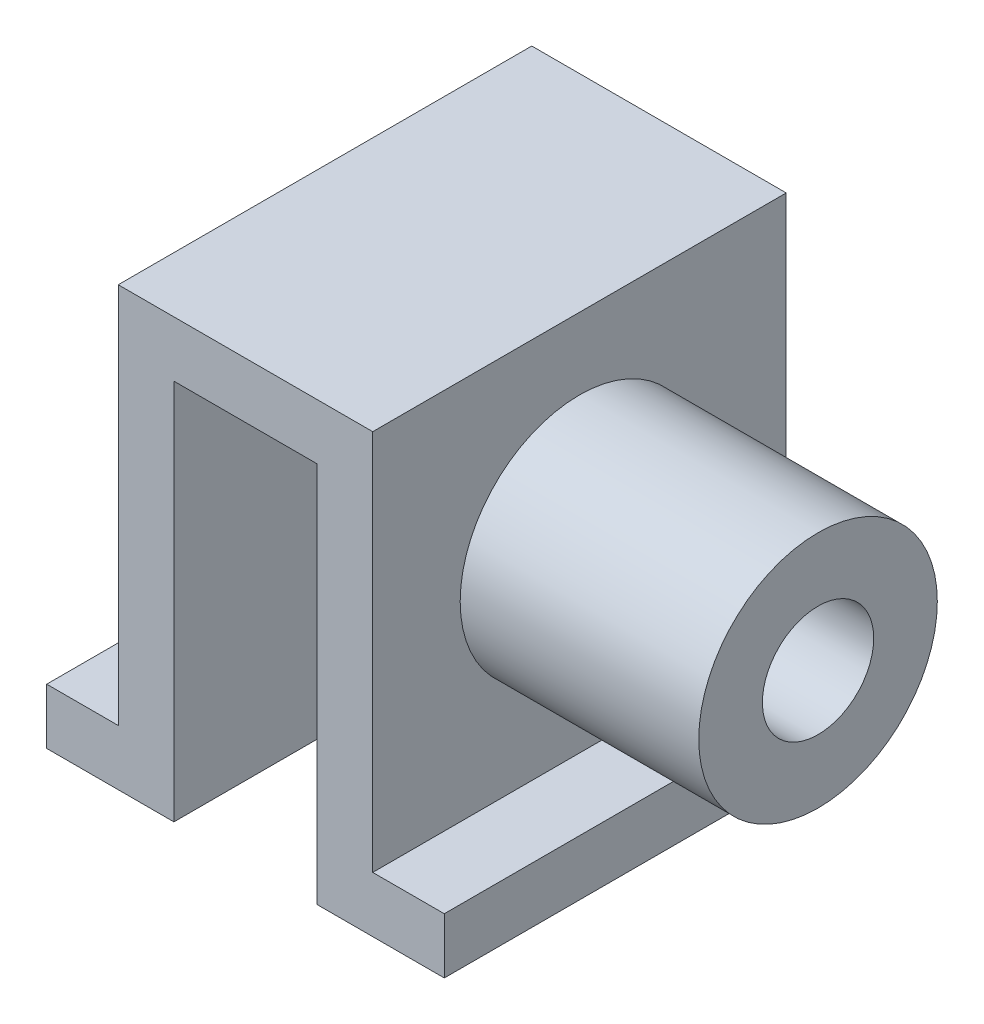
ISO-10303-21;
HEADER;
FILE_DESCRIPTION(('STEP AP214'),'2;1');
FILE_NAME('part.step','',(''),(''),'','','');
FILE_SCHEMA(('AUTOMOTIVE_DESIGN { 1 0 10303 214 1 1 1 1 }'));
ENDSEC;
DATA;
#1=APPLICATION_CONTEXT('core data for automotive mechanical design processes');
#2=APPLICATION_PROTOCOL_DEFINITION('international standard','automotive_design',2000,#1);
#3=PRODUCT_CONTEXT('',#1,'mechanical');
#4=PRODUCT('Part','Part','',(#3));
#5=PRODUCT_RELATED_PRODUCT_CATEGORY('part','',(#4));
#6=PRODUCT_DEFINITION_FORMATION('','',#4);
#7=PRODUCT_DEFINITION_CONTEXT('part definition',#1,'design');
#8=PRODUCT_DEFINITION('design','',#6,#7);
#9=PRODUCT_DEFINITION_SHAPE('','',#8);
#10=(LENGTH_UNIT() NAMED_UNIT(*) SI_UNIT(.MILLI.,.METRE.));
#11=(NAMED_UNIT(*) PLANE_ANGLE_UNIT() SI_UNIT($,.RADIAN.));
#12=(NAMED_UNIT(*) SI_UNIT($,.STERADIAN.) SOLID_ANGLE_UNIT());
#13=UNCERTAINTY_MEASURE_WITH_UNIT(LENGTH_MEASURE(1.E-05),#10,'distance_accuracy_value','');
#14=(GEOMETRIC_REPRESENTATION_CONTEXT(3) GLOBAL_UNCERTAINTY_ASSIGNED_CONTEXT((#13)) GLOBAL_UNIT_ASSIGNED_CONTEXT((#10,
#11,#12)) REPRESENTATION_CONTEXT('',''));
#15=CARTESIAN_POINT('',(0.,0.,0.));
#16=DIRECTION('',(0.,0.,1.));
#17=DIRECTION('',(1.,0.,0.));
#18=AXIS2_PLACEMENT_3D('',#15,#16,#17);
#19=CARTESIAN_POINT('',(16.,7.,26.));
#20=DIRECTION('',(0.,-1.,0.));
#21=DIRECTION('',(0.,0.,-1.));
#22=AXIS2_PLACEMENT_3D('',#19,#20,#21);
#23=PLANE('',#22);
#24=DIRECTION('',(-1.,0.,0.));
#25=VECTOR('',#24,1.);
#26=CARTESIAN_POINT('',(16.,7.,-26.));
#27=LINE('',#26,#25);
#28=CARTESIAN_POINT('',(25.,7.,-26.));
#29=VERTEX_POINT('',#28);
#30=CARTESIAN_POINT('',(16.,7.,-26.));
#31=VERTEX_POINT('',#30);
#32=EDGE_CURVE('E164',#29,#31,#27,.T.);
#33=ORIENTED_EDGE('',*,*,#32,.T.);
#34=DIRECTION('',(0.,0.,-1.));
#35=VECTOR('',#34,1.);
#36=CARTESIAN_POINT('',(16.,7.,26.));
#37=LINE('',#36,#35);
#38=CARTESIAN_POINT('',(16.,7.,26.));
#39=VERTEX_POINT('',#38);
#40=EDGE_CURVE('E48',#39,#31,#37,.T.);
#41=ORIENTED_EDGE('',*,*,#40,.F.);
#42=DIRECTION('',(-1.,0.,0.));
#43=VECTOR('',#42,1.);
#44=CARTESIAN_POINT('',(16.,7.,26.));
#45=LINE('',#44,#43);
#46=CARTESIAN_POINT('',(25.,7.,26.));
#47=VERTEX_POINT('',#46);
#48=EDGE_CURVE('E202',#47,#39,#45,.T.);
#49=ORIENTED_EDGE('',*,*,#48,.F.);
#50=DIRECTION('',(0.,0.,-1.));
#51=VECTOR('',#50,1.);
#52=CARTESIAN_POINT('',(25.,7.,26.));
#53=LINE('',#52,#51);
#54=EDGE_CURVE('E160',#47,#29,#53,.T.);
#55=ORIENTED_EDGE('',*,*,#54,.T.);
#56=EDGE_LOOP('',(#33,#41,#49,#55));
#57=FACE_BOUND('',#56,.T.);
#58=ADVANCED_FACE('F39',(#57),#23,.F.);
#59=CARTESIAN_POINT('',(16.,55.,26.));
#60=DIRECTION('',(-1.,0.,0.));
#61=DIRECTION('',(0.,-1.,0.));
#62=AXIS2_PLACEMENT_3D('',#59,#60,#61);
#63=PLANE('',#62);
#64=CARTESIAN_POINT('',(16.,31.,0.));
#65=DIRECTION('',(-1.,0.,0.));
#66=DIRECTION('',(0.,-1.,0.));
#67=AXIS2_PLACEMENT_3D('',#64,#65,#66);
#68=CIRCLE('',#67,15.);
#69=CARTESIAN_POINT('',(16.,16.,0.));
#70=VERTEX_POINT('',#69);
#71=EDGE_CURVE('E11',#70,#70,#68,.F.);
#72=ORIENTED_EDGE('',*,*,#71,.F.);
#73=EDGE_LOOP('',(#72));
#74=FACE_BOUND('',#73,.T.);
#75=DIRECTION('',(0.,1.,0.));
#76=VECTOR('',#75,1.);
#77=CARTESIAN_POINT('',(16.,55.,-26.));
#78=LINE('',#77,#76);
#79=CARTESIAN_POINT('',(16.,55.,-26.));
#80=VERTEX_POINT('',#79);
#81=EDGE_CURVE('E168',#31,#80,#78,.T.);
#82=ORIENTED_EDGE('',*,*,#81,.T.);
#83=DIRECTION('',(0.,0.,-1.));
#84=VECTOR('',#83,1.);
#85=CARTESIAN_POINT('',(16.,55.,26.));
#86=LINE('',#85,#84);
#87=CARTESIAN_POINT('',(16.,55.,26.));
#88=VERTEX_POINT('',#87);
#89=EDGE_CURVE('E233',#88,#80,#86,.T.);
#90=ORIENTED_EDGE('',*,*,#89,.F.);
#91=DIRECTION('',(0.,1.,0.));
#92=VECTOR('',#91,1.);
#93=CARTESIAN_POINT('',(16.,7.,26.));
#94=LINE('',#93,#92);
#95=EDGE_CURVE('E112',#39,#88,#94,.T.);
#96=ORIENTED_EDGE('',*,*,#95,.F.);
#97=ORIENTED_EDGE('',*,*,#40,.T.);
#98=EDGE_LOOP('',(#82,#90,#96,#97));
#99=FACE_BOUND('',#98,.T.);
#100=ADVANCED_FACE('F238',(#74,#99),#63,.F.);
#101=CARTESIAN_POINT('',(-16.,55.,26.));
#102=DIRECTION('',(0.,-1.,0.));
#103=DIRECTION('',(0.,0.,-1.));
#104=AXIS2_PLACEMENT_3D('',#101,#102,#103);
#105=PLANE('',#104);
#106=DIRECTION('',(-1.,0.,0.));
#107=VECTOR('',#106,1.);
#108=CARTESIAN_POINT('',(-16.,55.,-26.));
#109=LINE('',#108,#107);
#110=CARTESIAN_POINT('',(-16.,55.,-26.));
#111=VERTEX_POINT('',#110);
#112=EDGE_CURVE('E172',#80,#111,#109,.T.);
#113=ORIENTED_EDGE('',*,*,#112,.T.);
#114=DIRECTION('',(0.,0.,-1.));
#115=VECTOR('',#114,1.);
#116=CARTESIAN_POINT('',(-16.,55.,26.));
#117=LINE('',#116,#115);
#118=CARTESIAN_POINT('',(-16.,55.,26.));
#119=VERTEX_POINT('',#118);
#120=EDGE_CURVE('E229',#119,#111,#117,.T.);
#121=ORIENTED_EDGE('',*,*,#120,.F.);
#122=DIRECTION('',(-1.,0.,0.));
#123=VECTOR('',#122,1.);
#124=CARTESIAN_POINT('',(-16.,55.,26.));
#125=LINE('',#124,#123);
#126=EDGE_CURVE('E258',#88,#119,#125,.T.);
#127=ORIENTED_EDGE('',*,*,#126,.F.);
#128=ORIENTED_EDGE('',*,*,#89,.T.);
#129=EDGE_LOOP('',(#113,#121,#127,#128));
#130=FACE_BOUND('',#129,.T.);
#131=ADVANCED_FACE('F248',(#130),#105,.F.);
#132=CARTESIAN_POINT('',(-16.,7.,26.));
#133=DIRECTION('',(1.,0.,0.));
#134=DIRECTION('',(0.,0.,-1.));
#135=AXIS2_PLACEMENT_3D('',#132,#133,#134);
#136=PLANE('',#135);
#137=DIRECTION('',(0.,-1.,0.));
#138=VECTOR('',#137,1.);
#139=CARTESIAN_POINT('',(-16.,7.,-26.));
#140=LINE('',#139,#138);
#141=CARTESIAN_POINT('',(-16.,7.,-26.));
#142=VERTEX_POINT('',#141);
#143=EDGE_CURVE('E176',#111,#142,#140,.T.);
#144=ORIENTED_EDGE('',*,*,#143,.T.);
#145=DIRECTION('',(0.,0.,-1.));
#146=VECTOR('',#145,1.);
#147=CARTESIAN_POINT('',(-16.,7.,26.));
#148=LINE('',#147,#146);
#149=CARTESIAN_POINT('',(-16.,7.,26.));
#150=VERTEX_POINT('',#149);
#151=EDGE_CURVE('E225',#150,#142,#148,.T.);
#152=ORIENTED_EDGE('',*,*,#151,.F.);
#153=DIRECTION('',(0.,-1.,0.));
#154=VECTOR('',#153,1.);
#155=CARTESIAN_POINT('',(-16.,48.,26.));
#156=LINE('',#155,#154);
#157=EDGE_CURVE('E254',#119,#150,#156,.T.);
#158=ORIENTED_EDGE('',*,*,#157,.F.);
#159=ORIENTED_EDGE('',*,*,#120,.T.);
#160=EDGE_LOOP('',(#144,#152,#158,#159));
#161=FACE_BOUND('',#160,.T.);
#162=ADVANCED_FACE('F252',(#161),#136,.F.);
#163=CARTESIAN_POINT('',(-25.,7.,26.));
#164=DIRECTION('',(0.,-1.,0.));
#165=DIRECTION('',(0.,0.,-1.));
#166=AXIS2_PLACEMENT_3D('',#163,#164,#165);
#167=PLANE('',#166);
#168=DIRECTION('',(-1.,0.,0.));
#169=VECTOR('',#168,1.);
#170=CARTESIAN_POINT('',(-25.,7.,-26.));
#171=LINE('',#170,#169);
#172=CARTESIAN_POINT('',(-25.,7.,-26.));
#173=VERTEX_POINT('',#172);
#174=EDGE_CURVE('E179',#142,#173,#171,.T.);
#175=ORIENTED_EDGE('',*,*,#174,.T.);
#176=DIRECTION('',(0.,0.,-1.));
#177=VECTOR('',#176,1.);
#178=CARTESIAN_POINT('',(-25.,7.,26.));
#179=LINE('',#178,#177);
#180=CARTESIAN_POINT('',(-25.,7.,26.));
#181=VERTEX_POINT('',#180);
#182=EDGE_CURVE('E221',#181,#173,#179,.T.);
#183=ORIENTED_EDGE('',*,*,#182,.F.);
#184=DIRECTION('',(-1.,0.,0.));
#185=VECTOR('',#184,1.);
#186=CARTESIAN_POINT('',(-25.,7.,26.));
#187=LINE('',#186,#185);
#188=EDGE_CURVE('E257',#150,#181,#187,.T.);
#189=ORIENTED_EDGE('',*,*,#188,.F.);
#190=ORIENTED_EDGE('',*,*,#151,.T.);
#191=EDGE_LOOP('',(#175,#183,#189,#190));
#192=FACE_BOUND('',#191,.T.);
#193=ADVANCED_FACE('F294',(#192),#167,.F.);
#194=CARTESIAN_POINT('',(-25.,7.,26.));
#195=DIRECTION('',(1.,0.,0.));
#196=DIRECTION('',(0.,0.,-1.));
#197=AXIS2_PLACEMENT_3D('',#194,#195,#196);
#198=PLANE('',#197);
#199=DIRECTION('',(0.,-1.,0.));
#200=VECTOR('',#199,1.);
#201=CARTESIAN_POINT('',(-25.,7.,-26.));
#202=LINE('',#201,#200);
#203=CARTESIAN_POINT('',(-25.,0.,-26.));
#204=VERTEX_POINT('',#203);
#205=EDGE_CURVE('E182',#173,#204,#202,.T.);
#206=ORIENTED_EDGE('',*,*,#205,.T.);
#207=DIRECTION('',(0.,0.,-1.));
#208=VECTOR('',#207,1.);
#209=CARTESIAN_POINT('',(-25.,0.,26.));
#210=LINE('',#209,#208);
#211=CARTESIAN_POINT('',(-25.,0.,26.));
#212=VERTEX_POINT('',#211);
#213=EDGE_CURVE('E217',#212,#204,#210,.T.);
#214=ORIENTED_EDGE('',*,*,#213,.F.);
#215=DIRECTION('',(0.,-1.,0.));
#216=VECTOR('',#215,1.);
#217=CARTESIAN_POINT('',(-25.,7.,26.));
#218=LINE('',#217,#216);
#219=EDGE_CURVE('E262',#181,#212,#218,.T.);
#220=ORIENTED_EDGE('',*,*,#219,.F.);
#221=ORIENTED_EDGE('',*,*,#182,.T.);
#222=EDGE_LOOP('',(#206,#214,#220,#221));
#223=FACE_BOUND('',#222,.T.);
#224=ADVANCED_FACE('F291',(#223),#198,.F.);
#225=CARTESIAN_POINT('',(-25.,0.,26.));
#226=DIRECTION('',(0.,1.,0.));
#227=DIRECTION('',(0.,0.,1.));
#228=AXIS2_PLACEMENT_3D('',#225,#226,#227);
#229=PLANE('',#228);
#230=DIRECTION('',(1.,0.,0.));
#231=VECTOR('',#230,1.);
#232=CARTESIAN_POINT('',(-25.,0.,-26.));
#233=LINE('',#232,#231);
#234=CARTESIAN_POINT('',(-9.,0.,-26.));
#235=VERTEX_POINT('',#234);
#236=EDGE_CURVE('E185',#204,#235,#233,.T.);
#237=ORIENTED_EDGE('',*,*,#236,.T.);
#238=DIRECTION('',(0.,0.,-1.));
#239=VECTOR('',#238,1.);
#240=CARTESIAN_POINT('',(-9.,0.,26.));
#241=LINE('',#240,#239);
#242=CARTESIAN_POINT('',(-9.,0.,26.));
#243=VERTEX_POINT('',#242);
#244=EDGE_CURVE('E213',#243,#235,#241,.T.);
#245=ORIENTED_EDGE('',*,*,#244,.F.);
#246=DIRECTION('',(1.,0.,0.));
#247=VECTOR('',#246,1.);
#248=CARTESIAN_POINT('',(-25.,0.,26.));
#249=LINE('',#248,#247);
#250=EDGE_CURVE('E269',#212,#243,#249,.T.);
#251=ORIENTED_EDGE('',*,*,#250,.F.);
#252=ORIENTED_EDGE('',*,*,#213,.T.);
#253=EDGE_LOOP('',(#237,#245,#251,#252));
#254=FACE_BOUND('',#253,.T.);
#255=ADVANCED_FACE('F287',(#254),#229,.F.);
#256=CARTESIAN_POINT('',(-9.,7.,26.));
#257=DIRECTION('',(-1.,0.,0.));
#258=DIRECTION('',(0.,-1.,0.));
#259=AXIS2_PLACEMENT_3D('',#256,#257,#258);
#260=PLANE('',#259);
#261=DIRECTION('',(0.,1.,0.));
#262=VECTOR('',#261,1.);
#263=CARTESIAN_POINT('',(-9.,7.,-26.));
#264=LINE('',#263,#262);
#265=CARTESIAN_POINT('',(-9.,48.,-26.));
#266=VERTEX_POINT('',#265);
#267=EDGE_CURVE('E189',#235,#266,#264,.T.);
#268=ORIENTED_EDGE('',*,*,#267,.T.);
#269=DIRECTION('',(0.,0.,-1.));
#270=VECTOR('',#269,1.);
#271=CARTESIAN_POINT('',(-9.,48.,26.));
#272=LINE('',#271,#270);
#273=CARTESIAN_POINT('',(-9.,48.,26.));
#274=VERTEX_POINT('',#273);
#275=EDGE_CURVE('E209',#274,#266,#272,.T.);
#276=ORIENTED_EDGE('',*,*,#275,.F.);
#277=DIRECTION('',(0.,1.,0.));
#278=VECTOR('',#277,1.);
#279=CARTESIAN_POINT('',(-9.,7.,26.));
#280=LINE('',#279,#278);
#281=EDGE_CURVE('E272',#243,#274,#280,.T.);
#282=ORIENTED_EDGE('',*,*,#281,.F.);
#283=ORIENTED_EDGE('',*,*,#244,.T.);
#284=EDGE_LOOP('',(#268,#276,#282,#283));
#285=FACE_BOUND('',#284,.T.);
#286=ADVANCED_FACE('F280',(#285),#260,.F.);
#287=CARTESIAN_POINT('',(-9.,48.,26.));
#288=DIRECTION('',(0.,1.,0.));
#289=DIRECTION('',(0.,0.,1.));
#290=AXIS2_PLACEMENT_3D('',#287,#288,#289);
#291=PLANE('',#290);
#292=DIRECTION('',(1.,0.,0.));
#293=VECTOR('',#292,1.);
#294=CARTESIAN_POINT('',(-9.,48.,-26.));
#295=LINE('',#294,#293);
#296=CARTESIAN_POINT('',(8.99999999999999,48.,-26.));
#297=VERTEX_POINT('',#296);
#298=EDGE_CURVE('E192',#266,#297,#295,.T.);
#299=ORIENTED_EDGE('',*,*,#298,.T.);
#300=DIRECTION('',(0.,0.,-1.));
#301=VECTOR('',#300,1.);
#302=CARTESIAN_POINT('',(8.99999999999999,48.,26.));
#303=LINE('',#302,#301);
#304=CARTESIAN_POINT('',(8.99999999999999,48.,26.));
#305=VERTEX_POINT('',#304);
#306=EDGE_CURVE('E153',#305,#297,#303,.T.);
#307=ORIENTED_EDGE('',*,*,#306,.F.);
#308=DIRECTION('',(1.,0.,0.));
#309=VECTOR('',#308,1.);
#310=CARTESIAN_POINT('',(-9.,48.,26.));
#311=LINE('',#310,#309);
#312=EDGE_CURVE('E143',#274,#305,#311,.T.);
#313=ORIENTED_EDGE('',*,*,#312,.F.);
#314=ORIENTED_EDGE('',*,*,#275,.T.);
#315=EDGE_LOOP('',(#299,#307,#313,#314));
#316=FACE_BOUND('',#315,.T.);
#317=ADVANCED_FACE('F283',(#316),#291,.F.);
#318=CARTESIAN_POINT('',(9.,7.,26.));
#319=DIRECTION('',(1.,0.,0.));
#320=DIRECTION('',(0.,0.,-1.));
#321=AXIS2_PLACEMENT_3D('',#318,#319,#320);
#322=PLANE('',#321);
#323=CARTESIAN_POINT('',(9.,31.,0.));
#324=DIRECTION('',(1.,0.,0.));
#325=DIRECTION('',(0.,0.,-1.));
#326=AXIS2_PLACEMENT_3D('',#323,#324,#325);
#327=CIRCLE('',#326,7.);
#328=CARTESIAN_POINT('',(9.,31.,-7.));
#329=VERTEX_POINT('',#328);
#330=EDGE_CURVE('E458',#329,#329,#327,.F.);
#331=ORIENTED_EDGE('',*,*,#330,.F.);
#332=EDGE_LOOP('',(#331));
#333=FACE_BOUND('',#332,.T.);
#334=DIRECTION('',(0.,-1.,0.));
#335=VECTOR('',#334,1.);
#336=CARTESIAN_POINT('',(9.,7.,-26.));
#337=LINE('',#336,#335);
#338=CARTESIAN_POINT('',(9.,0.,-26.));
#339=VERTEX_POINT('',#338);
#340=EDGE_CURVE('E151',#297,#339,#337,.T.);
#341=ORIENTED_EDGE('',*,*,#340,.T.);
#342=DIRECTION('',(0.,0.,-1.));
#343=VECTOR('',#342,1.);
#344=CARTESIAN_POINT('',(9.,0.,26.));
#345=LINE('',#344,#343);
#346=CARTESIAN_POINT('',(9.,0.,26.));
#347=VERTEX_POINT('',#346);
#348=EDGE_CURVE('E149',#347,#339,#345,.T.);
#349=ORIENTED_EDGE('',*,*,#348,.F.);
#350=DIRECTION('',(0.,-1.,0.));
#351=VECTOR('',#350,1.);
#352=CARTESIAN_POINT('',(9.,7.,26.));
#353=LINE('',#352,#351);
#354=EDGE_CURVE('E137',#305,#347,#353,.T.);
#355=ORIENTED_EDGE('',*,*,#354,.F.);
#356=ORIENTED_EDGE('',*,*,#306,.T.);
#357=EDGE_LOOP('',(#341,#349,#355,#356));
#358=FACE_BOUND('',#357,.T.);
#359=ADVANCED_FACE('F150',(#333,#358),#322,.F.);
#360=CARTESIAN_POINT('',(9.,0.,26.));
#361=DIRECTION('',(0.,1.,0.));
#362=DIRECTION('',(0.,0.,1.));
#363=AXIS2_PLACEMENT_3D('',#360,#361,#362);
#364=PLANE('',#363);
#365=DIRECTION('',(1.,0.,0.));
#366=VECTOR('',#365,1.);
#367=CARTESIAN_POINT('',(9.,0.,-26.));
#368=LINE('',#367,#366);
#369=CARTESIAN_POINT('',(25.,0.,-26.));
#370=VERTEX_POINT('',#369);
#371=EDGE_CURVE('E97',#339,#370,#368,.T.);
#372=ORIENTED_EDGE('',*,*,#371,.T.);
#373=DIRECTION('',(0.,0.,-1.));
#374=VECTOR('',#373,1.);
#375=CARTESIAN_POINT('',(25.,0.,26.));
#376=LINE('',#375,#374);
#377=CARTESIAN_POINT('',(25.,0.,26.));
#378=VERTEX_POINT('',#377);
#379=EDGE_CURVE('E154',#378,#370,#376,.T.);
#380=ORIENTED_EDGE('',*,*,#379,.F.);
#381=DIRECTION('',(1.,0.,0.));
#382=VECTOR('',#381,1.);
#383=CARTESIAN_POINT('',(9.,0.,26.));
#384=LINE('',#383,#382);
#385=EDGE_CURVE('E141',#347,#378,#384,.T.);
#386=ORIENTED_EDGE('',*,*,#385,.F.);
#387=ORIENTED_EDGE('',*,*,#348,.T.);
#388=EDGE_LOOP('',(#372,#380,#386,#387));
#389=FACE_BOUND('',#388,.T.);
#390=ADVANCED_FACE('F156',(#389),#364,.F.);
#391=CARTESIAN_POINT('',(25.,7.,26.));
#392=DIRECTION('',(-1.,0.,0.));
#393=DIRECTION('',(0.,0.,1.));
#394=AXIS2_PLACEMENT_3D('',#391,#392,#393);
#395=PLANE('',#394);
#396=DIRECTION('',(0.,1.,0.));
#397=VECTOR('',#396,1.);
#398=CARTESIAN_POINT('',(25.,7.,-26.));
#399=LINE('',#398,#397);
#400=EDGE_CURVE('E103',#370,#29,#399,.T.);
#401=ORIENTED_EDGE('',*,*,#400,.T.);
#402=ORIENTED_EDGE('',*,*,#54,.F.);
#403=DIRECTION('',(0.,1.,0.));
#404=VECTOR('',#403,1.);
#405=CARTESIAN_POINT('',(25.,7.,26.));
#406=LINE('',#405,#404);
#407=EDGE_CURVE('E56',#378,#47,#406,.T.);
#408=ORIENTED_EDGE('',*,*,#407,.F.);
#409=ORIENTED_EDGE('',*,*,#379,.T.);
#410=EDGE_LOOP('',(#401,#402,#408,#409));
#411=FACE_BOUND('',#410,.T.);
#412=ADVANCED_FACE('F332',(#411),#395,.F.);
#413=CARTESIAN_POINT('',(0.,0.,26.));
#414=DIRECTION('',(0.,0.,-1.));
#415=DIRECTION('',(-1.,0.,0.));
#416=AXIS2_PLACEMENT_3D('',#413,#414,#415);
#417=PLANE('',#416);
#418=ORIENTED_EDGE('',*,*,#48,.T.);
#419=ORIENTED_EDGE('',*,*,#95,.T.);
#420=ORIENTED_EDGE('',*,*,#126,.T.);
#421=ORIENTED_EDGE('',*,*,#157,.T.);
#422=ORIENTED_EDGE('',*,*,#188,.T.);
#423=ORIENTED_EDGE('',*,*,#219,.T.);
#424=ORIENTED_EDGE('',*,*,#250,.T.);
#425=ORIENTED_EDGE('',*,*,#281,.T.);
#426=ORIENTED_EDGE('',*,*,#312,.T.);
#427=ORIENTED_EDGE('',*,*,#354,.T.);
#428=ORIENTED_EDGE('',*,*,#385,.T.);
#429=ORIENTED_EDGE('',*,*,#407,.T.);
#430=EDGE_LOOP('',(#418,#419,#420,#421,#422,#423,#424,#425,#426,#427,#428,#429));
#431=FACE_BOUND('',#430,.T.);
#432=ADVANCED_FACE('F139',(#431),#417,.F.);
#433=CARTESIAN_POINT('',(0.,0.,-26.));
#434=DIRECTION('',(0.,0.,-1.));
#435=DIRECTION('',(-1.,0.,0.));
#436=AXIS2_PLACEMENT_3D('',#433,#434,#435);
#437=PLANE('',#436);
#438=ORIENTED_EDGE('',*,*,#32,.F.);
#439=ORIENTED_EDGE('',*,*,#400,.F.);
#440=ORIENTED_EDGE('',*,*,#371,.F.);
#441=ORIENTED_EDGE('',*,*,#340,.F.);
#442=ORIENTED_EDGE('',*,*,#298,.F.);
#443=ORIENTED_EDGE('',*,*,#267,.F.);
#444=ORIENTED_EDGE('',*,*,#236,.F.);
#445=ORIENTED_EDGE('',*,*,#205,.F.);
#446=ORIENTED_EDGE('',*,*,#174,.F.);
#447=ORIENTED_EDGE('',*,*,#143,.F.);
#448=ORIENTED_EDGE('',*,*,#112,.F.);
#449=ORIENTED_EDGE('',*,*,#81,.F.);
#450=EDGE_LOOP('',(#438,#439,#440,#441,#442,#443,#444,#445,#446,#447,#448,#449));
#451=FACE_BOUND('',#450,.T.);
#452=ADVANCED_FACE('F243',(#451),#437,.T.);
#453=CARTESIAN_POINT('',(46.,31.,0.));
#454=DIRECTION('',(1.,0.,0.));
#455=DIRECTION('',(0.,1.,0.));
#456=AXIS2_PLACEMENT_3D('',#453,#454,#455);
#457=PLANE('',#456);
#458=CARTESIAN_POINT('',(46.,31.,0.));
#459=DIRECTION('',(1.,0.,0.));
#460=DIRECTION('',(0.,1.,0.));
#461=AXIS2_PLACEMENT_3D('',#458,#459,#460);
#462=CIRCLE('',#461,15.);
#463=CARTESIAN_POINT('',(46.,46.,0.));
#464=VERTEX_POINT('',#463);
#465=EDGE_CURVE('E169',#464,#464,#462,.T.);
#466=ORIENTED_EDGE('',*,*,#465,.T.);
#467=EDGE_LOOP('',(#466));
#468=FACE_BOUND('',#467,.T.);
#469=CARTESIAN_POINT('',(46.,31.,0.));
#470=DIRECTION('',(1.,0.,0.));
#471=DIRECTION('',(0.,1.,0.));
#472=AXIS2_PLACEMENT_3D('',#469,#470,#471);
#473=CIRCLE('',#472,7.);
#474=CARTESIAN_POINT('',(46.,38.,0.));
#475=VERTEX_POINT('',#474);
#476=EDGE_CURVE('E461',#475,#475,#473,.T.);
#477=ORIENTED_EDGE('',*,*,#476,.F.);
#478=EDGE_LOOP('',(#477));
#479=FACE_BOUND('',#478,.T.);
#480=ADVANCED_FACE('F317',(#468,#479),#457,.T.);
#481=CARTESIAN_POINT('',(46.,31.,0.));
#482=DIRECTION('',(-1.,0.,0.));
#483=DIRECTION('',(0.,-1.,0.));
#484=AXIS2_PLACEMENT_3D('',#481,#482,#483);
#485=CYLINDRICAL_SURFACE('',#484,15.);
#486=ORIENTED_EDGE('',*,*,#465,.F.);
#487=EDGE_LOOP('',(#486));
#488=FACE_BOUND('',#487,.T.);
#489=ORIENTED_EDGE('',*,*,#71,.T.);
#490=EDGE_LOOP('',(#489));
#491=FACE_BOUND('',#490,.T.);
#492=ADVANCED_FACE('F314',(#488,#491),#485,.T.);
#493=CARTESIAN_POINT('',(46.,31.,0.));
#494=DIRECTION('',(-1.,0.,0.));
#495=DIRECTION('',(0.,-1.,0.));
#496=AXIS2_PLACEMENT_3D('',#493,#494,#495);
#497=CYLINDRICAL_SURFACE('',#496,7.);
#498=ORIENTED_EDGE('',*,*,#476,.T.);
#499=EDGE_LOOP('',(#498));
#500=FACE_BOUND('',#499,.T.);
#501=ORIENTED_EDGE('',*,*,#330,.T.);
#502=EDGE_LOOP('',(#501));
#503=FACE_BOUND('',#502,.T.);
#504=ADVANCED_FACE('F316',(#500,#503),#497,.F.);
#505=CLOSED_SHELL('',(#58,#100,#131,#162,#193,#224,#255,#286,#317,#359,#390,#412,#432,#452,#480,
#492,#504));
#506=MANIFOLD_SOLID_BREP('B2',#505);
#507=ADVANCED_BREP_SHAPE_REPRESENTATION('',(#18,#506),#14);
#508=SHAPE_DEFINITION_REPRESENTATION(#9,#507);
ENDSEC;
END-ISO-10303-21;
